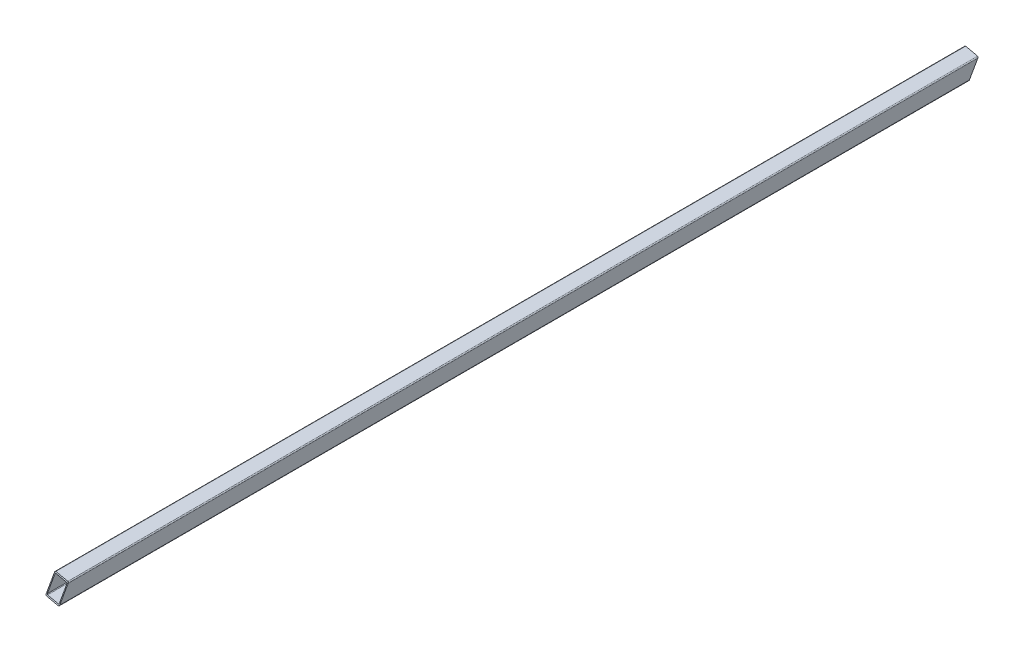
ISO-10303-21;
HEADER;
FILE_DESCRIPTION(('STEP AP214'),'2;1');
FILE_NAME('part.step','',(''),(''),'','','');
FILE_SCHEMA(('AUTOMOTIVE_DESIGN { 1 0 10303 214 1 1 1 1 }'));
ENDSEC;
DATA;
#1=APPLICATION_CONTEXT('core data for automotive mechanical design processes');
#2=APPLICATION_PROTOCOL_DEFINITION('international standard','automotive_design',2000,#1);
#3=PRODUCT_CONTEXT('',#1,'mechanical');
#4=PRODUCT('Part','Part','',(#3));
#5=PRODUCT_RELATED_PRODUCT_CATEGORY('part','',(#4));
#6=PRODUCT_DEFINITION_FORMATION('','',#4);
#7=PRODUCT_DEFINITION_CONTEXT('part definition',#1,'design');
#8=PRODUCT_DEFINITION('design','',#6,#7);
#9=PRODUCT_DEFINITION_SHAPE('','',#8);
#10=(LENGTH_UNIT() NAMED_UNIT(*) SI_UNIT(.MILLI.,.METRE.));
#11=(NAMED_UNIT(*) PLANE_ANGLE_UNIT() SI_UNIT($,.RADIAN.));
#12=(NAMED_UNIT(*) SI_UNIT($,.STERADIAN.) SOLID_ANGLE_UNIT());
#13=UNCERTAINTY_MEASURE_WITH_UNIT(LENGTH_MEASURE(1.E-05),#10,'distance_accuracy_value','');
#14=(GEOMETRIC_REPRESENTATION_CONTEXT(3) GLOBAL_UNCERTAINTY_ASSIGNED_CONTEXT((#13)) GLOBAL_UNIT_ASSIGNED_CONTEXT((#10,
#11,#12)) REPRESENTATION_CONTEXT('',''));
#15=CARTESIAN_POINT('',(0.,0.,0.));
#16=DIRECTION('',(0.,0.,1.));
#17=DIRECTION('',(1.,0.,0.));
#18=AXIS2_PLACEMENT_3D('',#15,#16,#17);
#19=CARTESIAN_POINT('',(-46.9999999999988,-47.,-2718.67074863422));
#20=DIRECTION('',(0.,0.,1.));
#21=DIRECTION('',(1.,0.,0.));
#22=AXIS2_PLACEMENT_3D('',#19,#20,#21);
#23=CYLINDRICAL_SURFACE('',#22,3.);
#24=DIRECTION('',(0.,0.,1.));
#25=VECTOR('',#24,1.);
#26=CARTESIAN_POINT('',(-49.9999999999988,-47.,-2718.67074863422));
#27=LINE('',#26,#25);
#28=CARTESIAN_POINT('',(-49.9999999999988,-47.,-2633.95531589803));
#29=VERTEX_POINT('',#28);
#30=CARTESIAN_POINT('',(-49.9999999999988,-47.,117.983919146623));
#31=VERTEX_POINT('',#30);
#32=EDGE_CURVE('E143',#29,#31,#27,.T.);
#33=ORIENTED_EDGE('',*,*,#32,.F.);
#34=CARTESIAN_POINT('',(-46.9999999999988,-47.,-2633.41966346477));
#35=DIRECTION('',(0.153121082326865,-0.491035125460982,-0.857577075084547));
#36=DIRECTION('',(0.255296453331627,-0.818695401615802,0.514355480469911));
#37=AXIS2_PLACEMENT_3D('',#34,#35,#36);
#38=ELLIPSE('',#37,3.49822784115846,3.);
#39=CARTESIAN_POINT('',(-46.9999999999988,-50.,-2631.70191071789));
#40=VERTEX_POINT('',#39);
#41=EDGE_CURVE('E169',#29,#40,#38,.F.);
#42=ORIENTED_EDGE('',*,*,#41,.T.);
#43=DIRECTION('',(0.,0.,1.));
#44=VECTOR('',#43,1.);
#45=CARTESIAN_POINT('',(-46.9999999999988,-50.,-2718.67074863422));
#46=LINE('',#45,#44);
#47=CARTESIAN_POINT('',(-46.9999999999988,-50.,120.237324326761));
#48=VERTEX_POINT('',#47);
#49=EDGE_CURVE('E166',#40,#48,#46,.T.);
#50=ORIENTED_EDGE('',*,*,#49,.T.);
#51=CARTESIAN_POINT('',(-46.9999999999988,-47.,118.519571579887));
#52=DIRECTION('',(-0.153121082326865,0.491035125460982,0.857577075084547));
#53=DIRECTION('',(-0.255296453331627,0.818695401615802,-0.514355480469911));
#54=AXIS2_PLACEMENT_3D('',#51,#52,#53);
#55=ELLIPSE('',#54,3.49822784115846,3.);
#56=EDGE_CURVE('E235',#31,#48,#55,.T.);
#57=ORIENTED_EDGE('',*,*,#56,.F.);
#58=EDGE_LOOP('',(#33,#42,#50,#57));
#59=FACE_BOUND('',#58,.T.);
#60=ADVANCED_FACE('F35',(#59),#23,.T.);
#61=CARTESIAN_POINT('',(-49.9999999999988,-3.00000000000002,-2718.67074863422));
#62=DIRECTION('',(-1.,0.,0.));
#63=DIRECTION('',(0.,0.,1.));
#64=AXIS2_PLACEMENT_3D('',#61,#62,#63);
#65=PLANE('',#64);
#66=DIRECTION('',(0.,0.,1.));
#67=VECTOR('',#66,1.);
#68=CARTESIAN_POINT('',(-49.9999999999988,-3.00000000000002,-2718.67074863422));
#69=LINE('',#68,#67);
#70=CARTESIAN_POINT('',(-49.9999999999988,-3.00000000000002,-2659.14902285219));
#71=VERTEX_POINT('',#70);
#72=CARTESIAN_POINT('',(-49.9999999999988,-3.00000000000002,92.790212192466));
#73=VERTEX_POINT('',#72);
#74=EDGE_CURVE('E147',#71,#73,#69,.T.);
#75=ORIENTED_EDGE('',*,*,#74,.F.);
#76=DIRECTION('',(0.,-0.8678107904326,0.496894789677599));
#77=VECTOR('',#76,1.);
#78=CARTESIAN_POINT('',(-49.9999999999988,22.6664026702321,-2673.84520074858));
#79=LINE('',#78,#77);
#80=EDGE_CURVE('E146',#71,#29,#79,.T.);
#81=ORIENTED_EDGE('',*,*,#80,.T.);
#82=ORIENTED_EDGE('',*,*,#32,.T.);
#83=DIRECTION('',(0.,-0.8678107904326,0.496894789677599));
#84=VECTOR('',#83,1.);
#85=CARTESIAN_POINT('',(-49.9999999999988,-43.3798483349713,115.911077324388));
#86=LINE('',#85,#84);
#87=EDGE_CURVE('E194',#73,#31,#86,.T.);
#88=ORIENTED_EDGE('',*,*,#87,.F.);
#89=EDGE_LOOP('',(#75,#81,#82,#88));
#90=FACE_BOUND('',#89,.T.);
#91=ADVANCED_FACE('F286',(#90),#65,.T.);
#92=CARTESIAN_POINT('',(-46.9999999999988,-3.00000000000002,-2718.67074863422));
#93=DIRECTION('',(0.,0.,1.));
#94=DIRECTION('',(1.,0.,0.));
#95=AXIS2_PLACEMENT_3D('',#92,#93,#94);
#96=CYLINDRICAL_SURFACE('',#95,3.00000000000001);
#97=DIRECTION('',(0.,0.,1.));
#98=VECTOR('',#97,1.);
#99=CARTESIAN_POINT('',(-46.9999999999988,0.,-2718.67074863422));
#100=LINE('',#99,#98);
#101=CARTESIAN_POINT('',(-46.9999999999988,0.,-2660.3311231658));
#102=VERTEX_POINT('',#101);
#103=CARTESIAN_POINT('',(-46.9999999999988,0.,91.6081118788557));
#104=VERTEX_POINT('',#103);
#105=EDGE_CURVE('E150',#102,#104,#100,.T.);
#106=ORIENTED_EDGE('',*,*,#105,.F.);
#107=CARTESIAN_POINT('',(-46.9999999999988,-3.00000000000002,-2658.61337041893));
#108=DIRECTION('',(0.153121082326865,-0.491035125460982,-0.857577075084547));
#109=DIRECTION('',(0.255296453331627,-0.818695401615802,0.514355480469911));
#110=AXIS2_PLACEMENT_3D('',#107,#108,#109);
#111=ELLIPSE('',#110,3.49822784115847,3.00000000000001);
#112=EDGE_CURVE('E106',#102,#71,#111,.F.);
#113=ORIENTED_EDGE('',*,*,#112,.T.);
#114=ORIENTED_EDGE('',*,*,#74,.T.);
#115=CARTESIAN_POINT('',(-46.9999999999988,-3.00000000000002,93.32586462573));
#116=DIRECTION('',(-0.153121082326865,0.491035125460982,0.857577075084547));
#117=DIRECTION('',(-0.255296453331627,0.818695401615802,-0.514355480469911));
#118=AXIS2_PLACEMENT_3D('',#115,#116,#117);
#119=ELLIPSE('',#118,3.49822784115847,3.00000000000001);
#120=EDGE_CURVE('E239',#104,#73,#119,.T.);
#121=ORIENTED_EDGE('',*,*,#120,.F.);
#122=EDGE_LOOP('',(#106,#113,#114,#121));
#123=FACE_BOUND('',#122,.T.);
#124=ADVANCED_FACE('F281',(#123),#96,.T.);
#125=CARTESIAN_POINT('',(-46.9999999999988,0.,-2718.67074863422));
#126=DIRECTION('',(0.,1.,0.));
#127=DIRECTION('',(-1.,0.,0.));
#128=AXIS2_PLACEMENT_3D('',#125,#126,#127);
#129=PLANE('',#128);
#130=DIRECTION('',(0.,0.,1.));
#131=VECTOR('',#130,1.);
#132=CARTESIAN_POINT('',(-2.99999999999883,0.,-2718.67074863422));
#133=LINE('',#132,#131);
#134=CARTESIAN_POINT('',(-2.99999999999882,0.,-2652.47488747793));
#135=VERTEX_POINT('',#134);
#136=CARTESIAN_POINT('',(-2.99999999999883,0.,99.4643475667299));
#137=VERTEX_POINT('',#136);
#138=EDGE_CURVE('E153',#135,#137,#133,.T.);
#139=ORIENTED_EDGE('',*,*,#138,.F.);
#140=DIRECTION('',(-0.984431087683826,0.,-0.175770969166241));
#141=VECTOR('',#140,1.);
#142=CARTESIAN_POINT('',(-57.0947624601654,0.,-2662.1335511908));
#143=LINE('',#142,#141);
#144=EDGE_CURVE('E109',#135,#102,#143,.T.);
#145=ORIENTED_EDGE('',*,*,#144,.T.);
#146=ORIENTED_EDGE('',*,*,#105,.T.);
#147=DIRECTION('',(-0.984431087683826,0.,-0.175770969166241));
#148=VECTOR('',#147,1.);
#149=CARTESIAN_POINT('',(-30.591999680895,0.,94.5377736441647));
#150=LINE('',#149,#148);
#151=EDGE_CURVE('E242',#137,#104,#150,.T.);
#152=ORIENTED_EDGE('',*,*,#151,.F.);
#153=EDGE_LOOP('',(#139,#145,#146,#152));
#154=FACE_BOUND('',#153,.T.);
#155=ADVANCED_FACE('F274',(#154),#129,.T.);
#156=CARTESIAN_POINT('',(-2.99999999999883,-3.00000000000002,-2718.67074863422));
#157=DIRECTION('',(0.,0.,1.));
#158=DIRECTION('',(1.,0.,0.));
#159=AXIS2_PLACEMENT_3D('',#156,#157,#158);
#160=CYLINDRICAL_SURFACE('',#159,3.00000000000001);
#161=DIRECTION('',(0.,0.,1.));
#162=VECTOR('',#161,1.);
#163=CARTESIAN_POINT('',(1.17787724018825E-12,-3.00000000000002,-2718.67074863422));
#164=LINE('',#163,#162);
#165=CARTESIAN_POINT('',(-1.38673081070378E-12,-3.,-2650.22148229779));
#166=VERTEX_POINT('',#165);
#167=CARTESIAN_POINT('',(1.17744355931926E-12,-3.00000000000002,101.717752746869));
#168=VERTEX_POINT('',#167);
#169=EDGE_CURVE('E156',#166,#168,#164,.T.);
#170=ORIENTED_EDGE('',*,*,#169,.F.);
#171=CARTESIAN_POINT('',(-2.99999999999883,-3.00000000000002,-2650.75713473105));
#172=DIRECTION('',(0.153121082326865,-0.491035125460982,-0.857577075084547));
#173=DIRECTION('',(0.255296453331627,-0.818695401615802,0.514355480469911));
#174=AXIS2_PLACEMENT_3D('',#171,#172,#173);
#175=ELLIPSE('',#174,3.49822784115847,3.00000000000001);
#176=EDGE_CURVE('E112',#166,#135,#175,.F.);
#177=ORIENTED_EDGE('',*,*,#176,.T.);
#178=ORIENTED_EDGE('',*,*,#138,.T.);
#179=CARTESIAN_POINT('',(-2.99999999999883,-3.00000000000002,101.182100313604));
#180=DIRECTION('',(-0.153121082326865,0.491035125460982,0.857577075084547));
#181=DIRECTION('',(-0.255296453331627,0.818695401615802,-0.514355480469911));
#182=AXIS2_PLACEMENT_3D('',#179,#180,#181);
#183=ELLIPSE('',#182,3.49822784115847,3.00000000000001);
#184=EDGE_CURVE('E246',#168,#137,#183,.T.);
#185=ORIENTED_EDGE('',*,*,#184,.F.);
#186=EDGE_LOOP('',(#170,#177,#178,#185));
#187=FACE_BOUND('',#186,.T.);
#188=ADVANCED_FACE('F270',(#187),#160,.T.);
#189=CARTESIAN_POINT('',(1.17267306976032E-12,-3.00000000000002,-2718.67074863422));
#190=DIRECTION('',(1.,0.,0.));
#191=DIRECTION('',(0.,0.,-1.));
#192=AXIS2_PLACEMENT_3D('',#189,#190,#191);
#193=PLANE('',#192);
#194=DIRECTION('',(0.,0.,1.));
#195=VECTOR('',#194,1.);
#196=CARTESIAN_POINT('',(1.17267306976032E-12,-47.,-2718.67074863422));
#197=LINE('',#196,#195);
#198=CARTESIAN_POINT('',(1.17093834628434E-12,-47.,-2625.02777534363));
#199=VERTEX_POINT('',#198);
#200=CARTESIAN_POINT('',(-1.18156580311819E-12,-47.0000000000002,126.911459701025));
#201=VERTEX_POINT('',#200);
#202=EDGE_CURVE('E159',#199,#201,#197,.T.);
#203=ORIENTED_EDGE('',*,*,#202,.F.);
#204=DIRECTION('',(0.,0.8678107904326,-0.496894789677599));
#205=VECTOR('',#204,1.);
#206=CARTESIAN_POINT('',(1.17267306976032E-12,26.5160533265865,-2667.121909524));
#207=LINE('',#206,#205);
#208=EDGE_CURVE('E75',#199,#166,#207,.T.);
#209=ORIENTED_EDGE('',*,*,#208,.T.);
#210=ORIENTED_EDGE('',*,*,#169,.T.);
#211=DIRECTION('',(0.,0.8678107904326,-0.496894789677599));
#212=VECTOR('',#211,1.);
#213=CARTESIAN_POINT('',(1.17267306976032E-12,-39.530197678617,122.634368548971));
#214=LINE('',#213,#212);
#215=EDGE_CURVE('E249',#201,#168,#214,.T.);
#216=ORIENTED_EDGE('',*,*,#215,.F.);
#217=EDGE_LOOP('',(#203,#209,#210,#216));
#218=FACE_BOUND('',#217,.T.);
#219=ADVANCED_FACE('F302',(#218),#193,.T.);
#220=CARTESIAN_POINT('',(-2.99999999999883,-47.,-2718.67074863422));
#221=DIRECTION('',(0.,0.,1.));
#222=DIRECTION('',(1.,0.,0.));
#223=AXIS2_PLACEMENT_3D('',#220,#221,#222);
#224=CYLINDRICAL_SURFACE('',#223,3.);
#225=DIRECTION('',(0.,0.,1.));
#226=VECTOR('',#225,1.);
#227=CARTESIAN_POINT('',(-2.99999999999882,-50.,-2718.67074863422));
#228=LINE('',#227,#226);
#229=CARTESIAN_POINT('',(-2.99999999999883,-50.,-2623.84567503002));
#230=VERTEX_POINT('',#229);
#231=CARTESIAN_POINT('',(-2.99999999999882,-50.,128.093560014636));
#232=VERTEX_POINT('',#231);
#233=EDGE_CURVE('E162',#230,#232,#228,.T.);
#234=ORIENTED_EDGE('',*,*,#233,.F.);
#235=CARTESIAN_POINT('',(-2.99999999999883,-47.,-2625.56342777689));
#236=DIRECTION('',(0.153121082326865,-0.491035125460982,-0.857577075084547));
#237=DIRECTION('',(0.255296453331627,-0.818695401615802,0.514355480469911));
#238=AXIS2_PLACEMENT_3D('',#235,#236,#237);
#239=ELLIPSE('',#238,3.49822784115846,3.);
#240=EDGE_CURVE('E67',#230,#199,#239,.F.);
#241=ORIENTED_EDGE('',*,*,#240,.T.);
#242=ORIENTED_EDGE('',*,*,#202,.T.);
#243=CARTESIAN_POINT('',(-2.99999999999883,-47.,126.375807267761));
#244=DIRECTION('',(-0.153121082326865,0.491035125460982,0.857577075084547));
#245=DIRECTION('',(-0.255296453331627,0.818695401615802,-0.514355480469911));
#246=AXIS2_PLACEMENT_3D('',#243,#244,#245);
#247=ELLIPSE('',#246,3.49822784115846,3.);
#248=EDGE_CURVE('E255',#232,#201,#247,.T.);
#249=ORIENTED_EDGE('',*,*,#248,.F.);
#250=EDGE_LOOP('',(#234,#241,#242,#249));
#251=FACE_BOUND('',#250,.T.);
#252=ADVANCED_FACE('F301',(#251),#224,.T.);
#253=CARTESIAN_POINT('',(-46.9999999999988,-50.,-2718.67074863422));
#254=DIRECTION('',(0.,-1.,0.));
#255=DIRECTION('',(0.,0.,-1.));
#256=AXIS2_PLACEMENT_3D('',#253,#254,#255);
#257=PLANE('',#256);
#258=ORIENTED_EDGE('',*,*,#49,.F.);
#259=DIRECTION('',(0.984431087683826,0.,0.175770969166241));
#260=VECTOR('',#259,1.);
#261=CARTESIAN_POINT('',(-62.0486012406306,-50.,-2634.38885067515));
#262=LINE('',#261,#260);
#263=EDGE_CURVE('E161',#40,#230,#262,.T.);
#264=ORIENTED_EDGE('',*,*,#263,.T.);
#265=ORIENTED_EDGE('',*,*,#233,.T.);
#266=DIRECTION('',(0.984431087683826,0.,0.175770969166241));
#267=VECTOR('',#266,1.);
#268=CARTESIAN_POINT('',(-35.5458384613601,-50.,122.282474159819));
#269=LINE('',#268,#267);
#270=EDGE_CURVE('E252',#48,#232,#269,.T.);
#271=ORIENTED_EDGE('',*,*,#270,.F.);
#272=EDGE_LOOP('',(#258,#264,#265,#271));
#273=FACE_BOUND('',#272,.T.);
#274=ADVANCED_FACE('F297',(#273),#257,.T.);
#275=CARTESIAN_POINT('',(-44.9999999999988,-45.,-2718.67074863422));
#276=DIRECTION('',(0.,0.,1.));
#277=DIRECTION('',(1.,0.,0.));
#278=AXIS2_PLACEMENT_3D('',#275,#276,#277);
#279=CYLINDRICAL_SURFACE('',#278,2.);
#280=CARTESIAN_POINT('',(-44.9999999999988,-45.,-2634.20773034051));
#281=DIRECTION('',(0.153121082326865,-0.491035125460982,-0.857577075084547));
#282=DIRECTION('',(0.255296453331627,-0.818695401615802,0.514355480469911));
#283=AXIS2_PLACEMENT_3D('',#280,#281,#282);
#284=ELLIPSE('',#283,2.33215189410564,2.);
#285=CARTESIAN_POINT('',(-46.9999999999988,-45.,-2634.56483196268));
#286=VERTEX_POINT('',#285);
#287=CARTESIAN_POINT('',(-44.9999999999988,-47.,-2633.06256184259));
#288=VERTEX_POINT('',#287);
#289=EDGE_CURVE('E114',#286,#288,#284,.F.);
#290=ORIENTED_EDGE('',*,*,#289,.F.);
#291=DIRECTION('',(0.,0.,1.));
#292=VECTOR('',#291,1.);
#293=CARTESIAN_POINT('',(-46.9999999999988,-45.,-2718.67074863422));
#294=LINE('',#293,#292);
#295=CARTESIAN_POINT('',(-46.9999999999988,-45.,117.374403081971));
#296=VERTEX_POINT('',#295);
#297=EDGE_CURVE('E165',#286,#296,#294,.T.);
#298=ORIENTED_EDGE('',*,*,#297,.T.);
#299=CARTESIAN_POINT('',(-44.9999999999988,-45.,117.731504704147));
#300=DIRECTION('',(-0.153121082326865,0.491035125460982,0.857577075084547));
#301=DIRECTION('',(-0.255296453331627,0.818695401615802,-0.514355480469911));
#302=AXIS2_PLACEMENT_3D('',#299,#300,#301);
#303=ELLIPSE('',#302,2.33215189410564,2.);
#304=CARTESIAN_POINT('',(-44.9999999999988,-47.,118.876673202063));
#305=VERTEX_POINT('',#304);
#306=EDGE_CURVE('E129',#296,#305,#303,.T.);
#307=ORIENTED_EDGE('',*,*,#306,.T.);
#308=DIRECTION('',(0.,0.,1.));
#309=VECTOR('',#308,1.);
#310=CARTESIAN_POINT('',(-44.9999999999988,-47.,-2718.67074863422));
#311=LINE('',#310,#309);
#312=EDGE_CURVE('E122',#288,#305,#311,.T.);
#313=ORIENTED_EDGE('',*,*,#312,.F.);
#314=EDGE_LOOP('',(#290,#298,#307,#313));
#315=FACE_BOUND('',#314,.T.);
#316=ADVANCED_FACE('F126',(#315),#279,.F.);
#317=CARTESIAN_POINT('',(-46.9999999999988,-5.00000000000002,-2718.67074863422));
#318=DIRECTION('',(-1.,0.,0.));
#319=DIRECTION('',(0.,0.,1.));
#320=AXIS2_PLACEMENT_3D('',#317,#318,#319);
#321=PLANE('',#320);
#322=DIRECTION('',(0.,-0.8678107904326,0.496894789677599));
#323=VECTOR('',#322,1.);
#324=CARTESIAN_POINT('',(-46.9999999999988,21.3911905736309,-2672.57938195472));
#325=LINE('',#324,#323);
#326=CARTESIAN_POINT('',(-46.9999999999988,-5.00000000000002,-2657.46820192101));
#327=VERTEX_POINT('',#326);
#328=EDGE_CURVE('E11',#327,#286,#325,.T.);
#329=ORIENTED_EDGE('',*,*,#328,.F.);
#330=DIRECTION('',(0.,0.,1.));
#331=VECTOR('',#330,1.);
#332=CARTESIAN_POINT('',(-46.9999999999988,-5.00000000000002,-2718.67074863422));
#333=LINE('',#332,#331);
#334=CARTESIAN_POINT('',(-46.9999999999988,-5.00000000000002,94.4710331236463));
#335=VERTEX_POINT('',#334);
#336=EDGE_CURVE('E171',#327,#335,#333,.T.);
#337=ORIENTED_EDGE('',*,*,#336,.T.);
#338=DIRECTION('',(0.,-0.8678107904326,0.496894789677599));
#339=VECTOR('',#338,1.);
#340=CARTESIAN_POINT('',(-46.9999999999988,-44.6550604315726,117.176896118247));
#341=LINE('',#340,#339);
#342=EDGE_CURVE('E243',#335,#296,#341,.T.);
#343=ORIENTED_EDGE('',*,*,#342,.T.);
#344=ORIENTED_EDGE('',*,*,#297,.F.);
#345=EDGE_LOOP('',(#329,#337,#343,#344));
#346=FACE_BOUND('',#345,.T.);
#347=ADVANCED_FACE('F336',(#346),#321,.F.);
#348=CARTESIAN_POINT('',(-44.9999999999988,-5.00000000000002,-2718.67074863422));
#349=DIRECTION('',(0.,0.,1.));
#350=DIRECTION('',(1.,0.,0.));
#351=AXIS2_PLACEMENT_3D('',#348,#349,#350);
#352=CYLINDRICAL_SURFACE('',#351,2.);
#353=CARTESIAN_POINT('',(-44.9999999999988,-5.00000000000002,-2657.11110029883));
#354=DIRECTION('',(0.153121082326865,-0.491035125460982,-0.857577075084547));
#355=DIRECTION('',(0.255296453331627,-0.818695401615802,0.514355480469911));
#356=AXIS2_PLACEMENT_3D('',#353,#354,#355);
#357=ELLIPSE('',#356,2.33215189410564,2.);
#358=CARTESIAN_POINT('',(-44.9999999999988,-3.00000000000002,-2658.25626879675));
#359=VERTEX_POINT('',#358);
#360=EDGE_CURVE('E45',#359,#327,#357,.F.);
#361=ORIENTED_EDGE('',*,*,#360,.F.);
#362=DIRECTION('',(0.,0.,1.));
#363=VECTOR('',#362,1.);
#364=CARTESIAN_POINT('',(-44.9999999999988,-3.00000000000002,-2718.67074863422));
#365=LINE('',#364,#363);
#366=CARTESIAN_POINT('',(-44.9999999999988,-3.00000000000002,93.6829662479063));
#367=VERTEX_POINT('',#366);
#368=EDGE_CURVE('E174',#359,#367,#365,.T.);
#369=ORIENTED_EDGE('',*,*,#368,.T.);
#370=CARTESIAN_POINT('',(-44.9999999999988,-5.00000000000002,94.8281347458225));
#371=DIRECTION('',(-0.153121082326865,0.491035125460982,0.857577075084547));
#372=DIRECTION('',(-0.255296453331627,0.818695401615802,-0.514355480469911));
#373=AXIS2_PLACEMENT_3D('',#370,#371,#372);
#374=ELLIPSE('',#373,2.33215189410564,2.);
#375=EDGE_CURVE('E238',#367,#335,#374,.T.);
#376=ORIENTED_EDGE('',*,*,#375,.T.);
#377=ORIENTED_EDGE('',*,*,#336,.F.);
#378=EDGE_LOOP('',(#361,#369,#376,#377));
#379=FACE_BOUND('',#378,.T.);
#380=ADVANCED_FACE('F332',(#379),#352,.F.);
#381=CARTESIAN_POINT('',(-44.9999999999988,-3.00000000000002,-2718.67074863422));
#382=DIRECTION('',(0.,1.,0.));
#383=DIRECTION('',(0.,0.,1.));
#384=AXIS2_PLACEMENT_3D('',#381,#382,#383);
#385=PLANE('',#384);
#386=DIRECTION('',(-0.984431087683826,0.,-0.175770969166241));
#387=VECTOR('',#386,1.);
#388=CARTESIAN_POINT('',(-55.4537836541966,-3.00000000000002,-2660.12280034715));
#389=LINE('',#388,#387);
#390=CARTESIAN_POINT('',(-4.99999999999883,-3.00000000000002,-2651.11423635323));
#391=VERTEX_POINT('',#390);
#392=EDGE_CURVE('E199',#391,#359,#389,.T.);
#393=ORIENTED_EDGE('',*,*,#392,.F.);
#394=DIRECTION('',(0.,0.,1.));
#395=VECTOR('',#394,1.);
#396=CARTESIAN_POINT('',(-4.99999999999883,-3.00000000000002,-2718.67074863422));
#397=LINE('',#396,#395);
#398=CARTESIAN_POINT('',(-4.99999999999883,-3.00000000000002,100.824998691428));
#399=VERTEX_POINT('',#398);
#400=EDGE_CURVE('E177',#391,#399,#397,.T.);
#401=ORIENTED_EDGE('',*,*,#400,.T.);
#402=DIRECTION('',(-0.984431087683826,0.,-0.175770969166241));
#403=VECTOR('',#402,1.);
#404=CARTESIAN_POINT('',(-28.9510208749262,-3.00000000000002,96.5485244878232));
#405=LINE('',#404,#403);
#406=EDGE_CURVE('E227',#399,#367,#405,.T.);
#407=ORIENTED_EDGE('',*,*,#406,.T.);
#408=ORIENTED_EDGE('',*,*,#368,.F.);
#409=EDGE_LOOP('',(#393,#401,#407,#408));
#410=FACE_BOUND('',#409,.T.);
#411=ADVANCED_FACE('F329',(#410),#385,.F.);
#412=CARTESIAN_POINT('',(-4.99999999999883,-5.00000000000002,-2718.67074863422));
#413=DIRECTION('',(0.,0.,1.));
#414=DIRECTION('',(1.,0.,0.));
#415=AXIS2_PLACEMENT_3D('',#412,#413,#414);
#416=CYLINDRICAL_SURFACE('',#415,2.);
#417=CARTESIAN_POINT('',(-4.99999999999883,-5.00000000000002,-2649.96906785531));
#418=DIRECTION('',(0.153121082326865,-0.491035125460982,-0.857577075084547));
#419=DIRECTION('',(0.255296453331627,-0.818695401615802,0.514355480469911));
#420=AXIS2_PLACEMENT_3D('',#417,#418,#419);
#421=ELLIPSE('',#420,2.33215189410564,2.);
#422=CARTESIAN_POINT('',(-2.99999999999883,-5.00000000000002,-2649.61196623313));
#423=VERTEX_POINT('',#422);
#424=EDGE_CURVE('E201',#423,#391,#421,.F.);
#425=ORIENTED_EDGE('',*,*,#424,.F.);
#426=DIRECTION('',(0.,0.,1.));
#427=VECTOR('',#426,1.);
#428=CARTESIAN_POINT('',(-2.99999999999883,-5.00000000000002,-2718.67074863422));
#429=LINE('',#428,#427);
#430=CARTESIAN_POINT('',(-2.99999999999883,-5.00000000000002,102.327268811521));
#431=VERTEX_POINT('',#430);
#432=EDGE_CURVE('E180',#423,#431,#429,.T.);
#433=ORIENTED_EDGE('',*,*,#432,.T.);
#434=CARTESIAN_POINT('',(-4.99999999999883,-5.00000000000002,101.970167189344));
#435=DIRECTION('',(-0.153121082326865,0.491035125460982,0.857577075084547));
#436=DIRECTION('',(-0.255296453331627,0.818695401615802,-0.514355480469911));
#437=AXIS2_PLACEMENT_3D('',#434,#435,#436);
#438=ELLIPSE('',#437,2.33215189410564,2.);
#439=EDGE_CURVE('E224',#431,#399,#438,.T.);
#440=ORIENTED_EDGE('',*,*,#439,.T.);
#441=ORIENTED_EDGE('',*,*,#400,.F.);
#442=EDGE_LOOP('',(#425,#433,#440,#441));
#443=FACE_BOUND('',#442,.T.);
#444=ADVANCED_FACE('F210',(#443),#416,.F.);
#445=CARTESIAN_POINT('',(-2.99999999999883,-5.00000000000002,-2718.67074863422));
#446=DIRECTION('',(1.,0.,0.));
#447=DIRECTION('',(0.,0.,-1.));
#448=AXIS2_PLACEMENT_3D('',#445,#446,#447);
#449=PLANE('',#448);
#450=DIRECTION('',(0.,0.8678107904326,-0.496894789677599));
#451=VECTOR('',#450,1.);
#452=CARTESIAN_POINT('',(-2.99999999999883,24.7788831512228,-2666.66288567709));
#453=LINE('',#452,#451);
#454=CARTESIAN_POINT('',(-2.99999999999883,-45.,-2626.70859627481));
#455=VERTEX_POINT('',#454);
#456=EDGE_CURVE('E139',#455,#423,#453,.T.);
#457=ORIENTED_EDGE('',*,*,#456,.F.);
#458=DIRECTION('',(0.,0.,1.));
#459=VECTOR('',#458,1.);
#460=CARTESIAN_POINT('',(-2.99999999999883,-45.,-2718.67074863422));
#461=LINE('',#460,#459);
#462=CARTESIAN_POINT('',(-2.99999999999883,-45.,125.230638769845));
#463=VERTEX_POINT('',#462);
#464=EDGE_CURVE('E183',#455,#463,#461,.T.);
#465=ORIENTED_EDGE('',*,*,#464,.T.);
#466=DIRECTION('',(0.,0.8678107904326,-0.496894789677599));
#467=VECTOR('',#466,1.);
#468=CARTESIAN_POINT('',(-2.99999999999883,-41.2673678539807,123.09339239588));
#469=LINE('',#468,#467);
#470=EDGE_CURVE('E217',#463,#431,#469,.T.);
#471=ORIENTED_EDGE('',*,*,#470,.T.);
#472=ORIENTED_EDGE('',*,*,#432,.F.);
#473=EDGE_LOOP('',(#457,#465,#471,#472));
#474=FACE_BOUND('',#473,.T.);
#475=ADVANCED_FACE('F215',(#474),#449,.F.);
#476=CARTESIAN_POINT('',(-4.99999999999883,-45.,-2718.67074863422));
#477=DIRECTION('',(0.,0.,1.));
#478=DIRECTION('',(1.,0.,0.));
#479=AXIS2_PLACEMENT_3D('',#476,#477,#478);
#480=CYLINDRICAL_SURFACE('',#479,2.);
#481=CARTESIAN_POINT('',(-4.99999999999883,-45.,-2627.06569789699));
#482=DIRECTION('',(0.153121082326865,-0.491035125460982,-0.857577075084547));
#483=DIRECTION('',(0.255296453331627,-0.818695401615802,0.514355480469911));
#484=AXIS2_PLACEMENT_3D('',#481,#482,#483);
#485=ELLIPSE('',#484,2.33215189410564,2.);
#486=CARTESIAN_POINT('',(-4.99999999999882,-47.,-2625.92052939907));
#487=VERTEX_POINT('',#486);
#488=EDGE_CURVE('E39',#487,#455,#485,.F.);
#489=ORIENTED_EDGE('',*,*,#488,.F.);
#490=DIRECTION('',(0.,0.,1.));
#491=VECTOR('',#490,1.);
#492=CARTESIAN_POINT('',(-4.99999999999883,-47.,-2718.67074863422));
#493=LINE('',#492,#491);
#494=CARTESIAN_POINT('',(-4.99999999999883,-47.,126.018705645585));
#495=VERTEX_POINT('',#494);
#496=EDGE_CURVE('E133',#487,#495,#493,.T.);
#497=ORIENTED_EDGE('',*,*,#496,.T.);
#498=CARTESIAN_POINT('',(-4.99999999999883,-45.,124.873537147669));
#499=DIRECTION('',(-0.153121082326865,0.491035125460982,0.857577075084547));
#500=DIRECTION('',(-0.255296453331627,0.818695401615802,-0.514355480469911));
#501=AXIS2_PLACEMENT_3D('',#498,#499,#500);
#502=ELLIPSE('',#501,2.33215189410564,2.);
#503=EDGE_CURVE('E225',#495,#463,#502,.T.);
#504=ORIENTED_EDGE('',*,*,#503,.T.);
#505=ORIENTED_EDGE('',*,*,#464,.F.);
#506=EDGE_LOOP('',(#489,#497,#504,#505));
#507=FACE_BOUND('',#506,.T.);
#508=ADVANCED_FACE('F321',(#507),#480,.F.);
#509=CARTESIAN_POINT('',(-44.9999999999988,-47.,-2718.67074863422));
#510=DIRECTION('',(0.,-1.,0.));
#511=DIRECTION('',(0.,0.,-1.));
#512=AXIS2_PLACEMENT_3D('',#509,#510,#511);
#513=PLANE('',#512);
#514=DIRECTION('',(0.984431087683826,0.,0.175770969166241));
#515=VECTOR('',#514,1.);
#516=CARTESIAN_POINT('',(-59.8131617810059,-47.,-2635.70746389337));
#517=LINE('',#516,#515);
#518=EDGE_CURVE('E117',#288,#487,#517,.T.);
#519=ORIENTED_EDGE('',*,*,#518,.F.);
#520=ORIENTED_EDGE('',*,*,#312,.T.);
#521=DIRECTION('',(0.984431087683826,0.,0.175770969166241));
#522=VECTOR('',#521,1.);
#523=CARTESIAN_POINT('',(-33.3103990017355,-47.,120.963860941599));
#524=LINE('',#523,#522);
#525=EDGE_CURVE('E229',#305,#495,#524,.T.);
#526=ORIENTED_EDGE('',*,*,#525,.T.);
#527=ORIENTED_EDGE('',*,*,#496,.F.);
#528=EDGE_LOOP('',(#519,#520,#526,#527));
#529=FACE_BOUND('',#528,.T.);
#530=ADVANCED_FACE('F136',(#529),#513,.F.);
#531=CARTESIAN_POINT('',(-86.9622542603097,983.807125403829,-3230.77888009588));
#532=DIRECTION('',(0.153121082326865,-0.491035125460982,-0.857577075084547));
#533=DIRECTION('',(0.,0.867810790432601,-0.496894789677599));
#534=AXIS2_PLACEMENT_3D('',#531,#532,#533);
#535=PLANE('',#534);
#536=ORIENTED_EDGE('',*,*,#208,.F.);
#537=ORIENTED_EDGE('',*,*,#240,.F.);
#538=ORIENTED_EDGE('',*,*,#263,.F.);
#539=ORIENTED_EDGE('',*,*,#41,.F.);
#540=ORIENTED_EDGE('',*,*,#80,.F.);
#541=ORIENTED_EDGE('',*,*,#112,.F.);
#542=ORIENTED_EDGE('',*,*,#144,.F.);
#543=ORIENTED_EDGE('',*,*,#176,.F.);
#544=EDGE_LOOP('',(#536,#537,#538,#539,#540,#541,#542,#543));
#545=FACE_BOUND('',#544,.T.);
#546=ORIENTED_EDGE('',*,*,#289,.T.);
#547=ORIENTED_EDGE('',*,*,#518,.T.);
#548=ORIENTED_EDGE('',*,*,#488,.T.);
#549=ORIENTED_EDGE('',*,*,#456,.T.);
#550=ORIENTED_EDGE('',*,*,#424,.T.);
#551=ORIENTED_EDGE('',*,*,#392,.T.);
#552=ORIENTED_EDGE('',*,*,#360,.T.);
#553=ORIENTED_EDGE('',*,*,#328,.T.);
#554=EDGE_LOOP('',(#546,#547,#548,#549,#550,#551,#552,#553));
#555=FACE_BOUND('',#554,.T.);
#556=ADVANCED_FACE('F37',(#545,#555),#535,.T.);
#557=CARTESIAN_POINT('',(-86.9622542603089,2170.47265975559,-1158.3056388025));
#558=DIRECTION('',(-0.153121082326865,0.491035125460982,0.857577075084547));
#559=DIRECTION('',(0.,-0.867810790432601,0.496894789677599));
#560=AXIS2_PLACEMENT_3D('',#557,#558,#559);
#561=PLANE('',#560);
#562=ORIENTED_EDGE('',*,*,#342,.F.);
#563=ORIENTED_EDGE('',*,*,#375,.F.);
#564=ORIENTED_EDGE('',*,*,#406,.F.);
#565=ORIENTED_EDGE('',*,*,#439,.F.);
#566=ORIENTED_EDGE('',*,*,#470,.F.);
#567=ORIENTED_EDGE('',*,*,#503,.F.);
#568=ORIENTED_EDGE('',*,*,#525,.F.);
#569=ORIENTED_EDGE('',*,*,#306,.F.);
#570=EDGE_LOOP('',(#562,#563,#564,#565,#566,#567,#568,#569));
#571=FACE_BOUND('',#570,.T.);
#572=ORIENTED_EDGE('',*,*,#248,.T.);
#573=ORIENTED_EDGE('',*,*,#215,.T.);
#574=ORIENTED_EDGE('',*,*,#184,.T.);
#575=ORIENTED_EDGE('',*,*,#151,.T.);
#576=ORIENTED_EDGE('',*,*,#120,.T.);
#577=ORIENTED_EDGE('',*,*,#87,.T.);
#578=ORIENTED_EDGE('',*,*,#56,.T.);
#579=ORIENTED_EDGE('',*,*,#270,.T.);
#580=EDGE_LOOP('',(#572,#573,#574,#575,#576,#577,#578,#579));
#581=FACE_BOUND('',#580,.T.);
#582=ADVANCED_FACE('F263',(#571,#581),#561,.T.);
#583=CLOSED_SHELL('',(#60,#91,#124,#155,#188,#219,#252,#274,#316,#347,#380,#411,#444,#475,#508,
#530,#556,#582));
#584=MANIFOLD_SOLID_BREP('B2',#583);
#585=ADVANCED_BREP_SHAPE_REPRESENTATION('',(#18,#584),#14);
#586=SHAPE_DEFINITION_REPRESENTATION(#9,#585);
ENDSEC;
END-ISO-10303-21;
